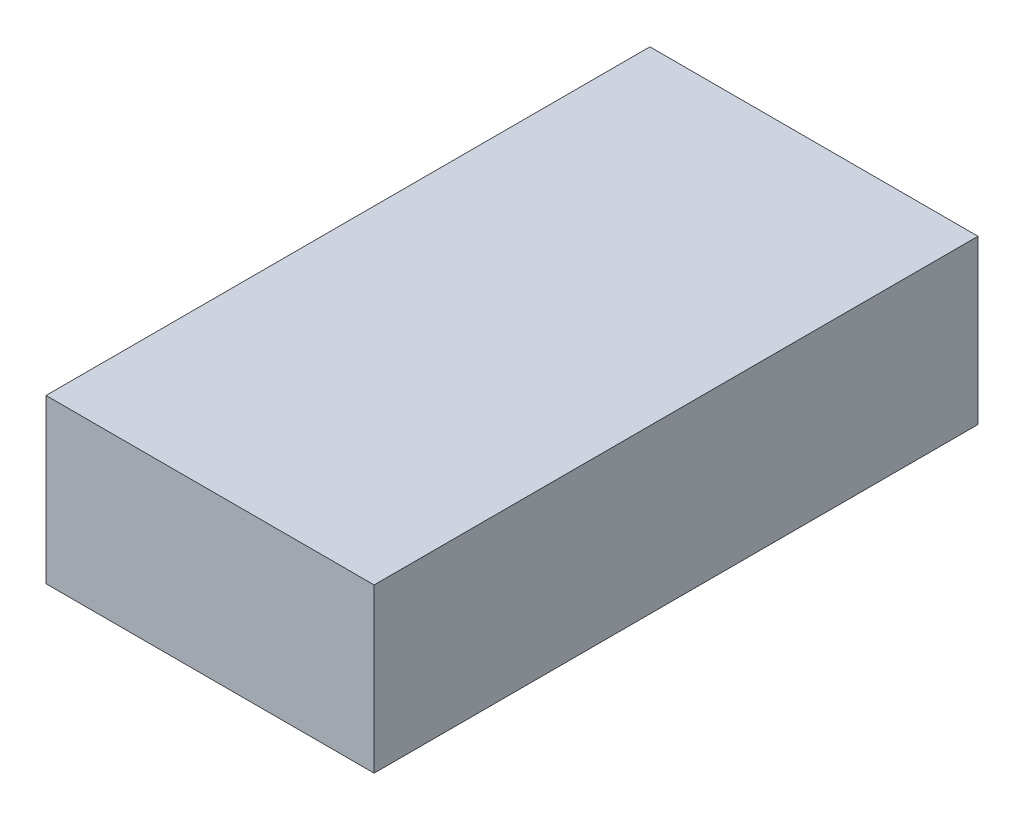
ISO-10303-21;
HEADER;
FILE_DESCRIPTION(('STEP AP214'),'2;1');
FILE_NAME('part.step','',(''),(''),'','','');
FILE_SCHEMA(('AUTOMOTIVE_DESIGN { 1 0 10303 214 1 1 1 1 }'));
ENDSEC;
DATA;
#1=APPLICATION_CONTEXT('core data for automotive mechanical design processes');
#2=APPLICATION_PROTOCOL_DEFINITION('international standard','automotive_design',2000,#1);
#3=PRODUCT_CONTEXT('',#1,'mechanical');
#4=PRODUCT('Part','Part','',(#3));
#5=PRODUCT_RELATED_PRODUCT_CATEGORY('part','',(#4));
#6=PRODUCT_DEFINITION_FORMATION('','',#4);
#7=PRODUCT_DEFINITION_CONTEXT('part definition',#1,'design');
#8=PRODUCT_DEFINITION('design','',#6,#7);
#9=PRODUCT_DEFINITION_SHAPE('','',#8);
#10=(LENGTH_UNIT() NAMED_UNIT(*) SI_UNIT(.MILLI.,.METRE.));
#11=(NAMED_UNIT(*) PLANE_ANGLE_UNIT() SI_UNIT($,.RADIAN.));
#12=(NAMED_UNIT(*) SI_UNIT($,.STERADIAN.) SOLID_ANGLE_UNIT());
#13=UNCERTAINTY_MEASURE_WITH_UNIT(LENGTH_MEASURE(1.E-05),#10,'distance_accuracy_value','');
#14=(GEOMETRIC_REPRESENTATION_CONTEXT(3) GLOBAL_UNCERTAINTY_ASSIGNED_CONTEXT((#13)) GLOBAL_UNIT_ASSIGNED_CONTEXT((#10,
#11,#12)) REPRESENTATION_CONTEXT('',''));
#15=CARTESIAN_POINT('',(0.,0.,0.));
#16=DIRECTION('',(0.,0.,1.));
#17=DIRECTION('',(1.,0.,0.));
#18=AXIS2_PLACEMENT_3D('',#15,#16,#17);
#19=CARTESIAN_POINT('',(0.,0.,150.));
#20=DIRECTION('',(1.,0.,0.));
#21=DIRECTION('',(0.,0.,-1.));
#22=AXIS2_PLACEMENT_3D('',#19,#20,#21);
#23=PLANE('',#22);
#24=DIRECTION('',(0.,-1.,0.));
#25=VECTOR('',#24,1.);
#26=CARTESIAN_POINT('',(0.,0.,0.));
#27=LINE('',#26,#25);
#28=CARTESIAN_POINT('',(0.,40.5,0.));
#29=VERTEX_POINT('',#28);
#30=CARTESIAN_POINT('',(0.,0.,0.));
#31=VERTEX_POINT('',#30);
#32=EDGE_CURVE('E98',#29,#31,#27,.T.);
#33=ORIENTED_EDGE('',*,*,#32,.T.);
#34=DIRECTION('',(0.,0.,-1.));
#35=VECTOR('',#34,1.);
#36=CARTESIAN_POINT('',(0.,0.,150.));
#37=LINE('',#36,#35);
#38=CARTESIAN_POINT('',(0.,0.,150.));
#39=VERTEX_POINT('',#38);
#40=EDGE_CURVE('E11',#39,#31,#37,.T.);
#41=ORIENTED_EDGE('',*,*,#40,.F.);
#42=DIRECTION('',(0.,-1.,0.));
#43=VECTOR('',#42,1.);
#44=CARTESIAN_POINT('',(0.,0.,150.));
#45=LINE('',#44,#43);
#46=CARTESIAN_POINT('',(0.,40.5,150.));
#47=VERTEX_POINT('',#46);
#48=EDGE_CURVE('E86',#47,#39,#45,.T.);
#49=ORIENTED_EDGE('',*,*,#48,.F.);
#50=DIRECTION('',(0.,0.,-1.));
#51=VECTOR('',#50,1.);
#52=CARTESIAN_POINT('',(0.,40.5,150.));
#53=LINE('',#52,#51);
#54=EDGE_CURVE('E94',#47,#29,#53,.T.);
#55=ORIENTED_EDGE('',*,*,#54,.T.);
#56=EDGE_LOOP('',(#33,#41,#49,#55));
#57=FACE_BOUND('',#56,.T.);
#58=ADVANCED_FACE('F35',(#57),#23,.F.);
#59=CARTESIAN_POINT('',(0.,0.,150.));
#60=DIRECTION('',(0.,1.,0.));
#61=DIRECTION('',(0.,0.,1.));
#62=AXIS2_PLACEMENT_3D('',#59,#60,#61);
#63=PLANE('',#62);
#64=DIRECTION('',(1.,0.,0.));
#65=VECTOR('',#64,1.);
#66=CARTESIAN_POINT('',(0.,0.,0.));
#67=LINE('',#66,#65);
#68=CARTESIAN_POINT('',(81.5,0.,0.));
#69=VERTEX_POINT('',#68);
#70=EDGE_CURVE('E90',#31,#69,#67,.T.);
#71=ORIENTED_EDGE('',*,*,#70,.T.);
#72=DIRECTION('',(0.,0.,-1.));
#73=VECTOR('',#72,1.);
#74=CARTESIAN_POINT('',(81.5,0.,150.));
#75=LINE('',#74,#73);
#76=CARTESIAN_POINT('',(81.5,0.,150.));
#77=VERTEX_POINT('',#76);
#78=EDGE_CURVE('E43',#77,#69,#75,.T.);
#79=ORIENTED_EDGE('',*,*,#78,.F.);
#80=DIRECTION('',(1.,0.,0.));
#81=VECTOR('',#80,1.);
#82=CARTESIAN_POINT('',(0.,0.,150.));
#83=LINE('',#82,#81);
#84=EDGE_CURVE('E81',#39,#77,#83,.T.);
#85=ORIENTED_EDGE('',*,*,#84,.F.);
#86=ORIENTED_EDGE('',*,*,#40,.T.);
#87=EDGE_LOOP('',(#71,#79,#85,#86));
#88=FACE_BOUND('',#87,.T.);
#89=ADVANCED_FACE('F89',(#88),#63,.F.);
#90=CARTESIAN_POINT('',(81.5,0.,150.));
#91=DIRECTION('',(-1.,0.,0.));
#92=DIRECTION('',(0.,0.,1.));
#93=AXIS2_PLACEMENT_3D('',#90,#91,#92);
#94=PLANE('',#93);
#95=DIRECTION('',(0.,1.,0.));
#96=VECTOR('',#95,1.);
#97=CARTESIAN_POINT('',(81.5,0.,0.));
#98=LINE('',#97,#96);
#99=CARTESIAN_POINT('',(81.5,40.5,0.));
#100=VERTEX_POINT('',#99);
#101=EDGE_CURVE('E68',#69,#100,#98,.T.);
#102=ORIENTED_EDGE('',*,*,#101,.T.);
#103=DIRECTION('',(0.,0.,-1.));
#104=VECTOR('',#103,1.);
#105=CARTESIAN_POINT('',(81.5,40.5,150.));
#106=LINE('',#105,#104);
#107=CARTESIAN_POINT('',(81.5,40.5,150.));
#108=VERTEX_POINT('',#107);
#109=EDGE_CURVE('E91',#108,#100,#106,.T.);
#110=ORIENTED_EDGE('',*,*,#109,.F.);
#111=DIRECTION('',(0.,1.,0.));
#112=VECTOR('',#111,1.);
#113=CARTESIAN_POINT('',(81.5,0.,150.));
#114=LINE('',#113,#112);
#115=EDGE_CURVE('E84',#77,#108,#114,.T.);
#116=ORIENTED_EDGE('',*,*,#115,.F.);
#117=ORIENTED_EDGE('',*,*,#78,.T.);
#118=EDGE_LOOP('',(#102,#110,#116,#117));
#119=FACE_BOUND('',#118,.T.);
#120=ADVANCED_FACE('F92',(#119),#94,.F.);
#121=CARTESIAN_POINT('',(0.,40.5,150.));
#122=DIRECTION('',(0.,-1.,0.));
#123=DIRECTION('',(0.,0.,-1.));
#124=AXIS2_PLACEMENT_3D('',#121,#122,#123);
#125=PLANE('',#124);
#126=DIRECTION('',(-1.,0.,0.));
#127=VECTOR('',#126,1.);
#128=CARTESIAN_POINT('',(0.,40.5,0.));
#129=LINE('',#128,#127);
#130=EDGE_CURVE('E74',#100,#29,#129,.T.);
#131=ORIENTED_EDGE('',*,*,#130,.T.);
#132=ORIENTED_EDGE('',*,*,#54,.F.);
#133=DIRECTION('',(-1.,0.,0.));
#134=VECTOR('',#133,1.);
#135=CARTESIAN_POINT('',(0.,40.5,150.));
#136=LINE('',#135,#134);
#137=EDGE_CURVE('E51',#108,#47,#136,.T.);
#138=ORIENTED_EDGE('',*,*,#137,.F.);
#139=ORIENTED_EDGE('',*,*,#109,.T.);
#140=EDGE_LOOP('',(#131,#132,#138,#139));
#141=FACE_BOUND('',#140,.T.);
#142=ADVANCED_FACE('F105',(#141),#125,.F.);
#143=CARTESIAN_POINT('',(0.,0.,150.));
#144=DIRECTION('',(0.,0.,-1.));
#145=DIRECTION('',(-1.,0.,0.));
#146=AXIS2_PLACEMENT_3D('',#143,#144,#145);
#147=PLANE('',#146);
#148=ORIENTED_EDGE('',*,*,#48,.T.);
#149=ORIENTED_EDGE('',*,*,#84,.T.);
#150=ORIENTED_EDGE('',*,*,#115,.T.);
#151=ORIENTED_EDGE('',*,*,#137,.T.);
#152=EDGE_LOOP('',(#148,#149,#150,#151));
#153=FACE_BOUND('',#152,.T.);
#154=ADVANCED_FACE('F82',(#153),#147,.F.);
#155=CARTESIAN_POINT('',(0.,0.,0.));
#156=DIRECTION('',(0.,0.,-1.));
#157=DIRECTION('',(-1.,0.,0.));
#158=AXIS2_PLACEMENT_3D('',#155,#156,#157);
#159=PLANE('',#158);
#160=ORIENTED_EDGE('',*,*,#32,.F.);
#161=ORIENTED_EDGE('',*,*,#130,.F.);
#162=ORIENTED_EDGE('',*,*,#101,.F.);
#163=ORIENTED_EDGE('',*,*,#70,.F.);
#164=EDGE_LOOP('',(#160,#161,#162,#163));
#165=FACE_BOUND('',#164,.T.);
#166=ADVANCED_FACE('F108',(#165),#159,.T.);
#167=CLOSED_SHELL('',(#58,#89,#120,#142,#154,#166));
#168=MANIFOLD_SOLID_BREP('B2',#167);
#169=ADVANCED_BREP_SHAPE_REPRESENTATION('',(#18,#168),#14);
#170=SHAPE_DEFINITION_REPRESENTATION(#9,#169);
ENDSEC;
END-ISO-10303-21;
